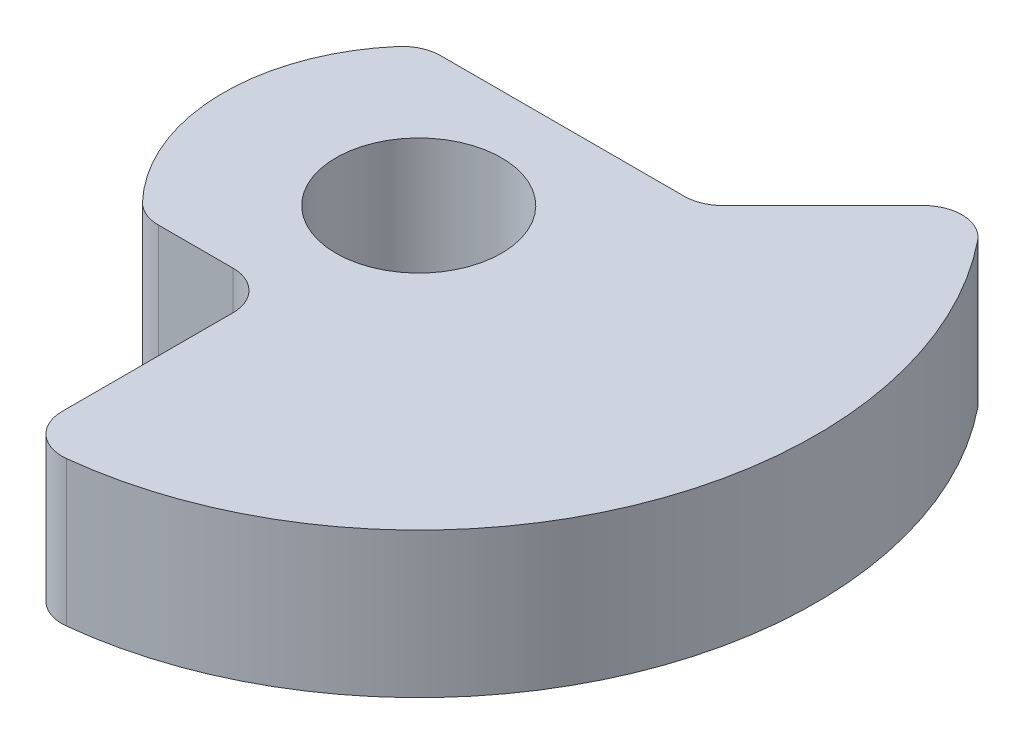
ISO-10303-21;
HEADER;
FILE_DESCRIPTION(('STEP AP214'),'2;1');
FILE_NAME('part.step','',(''),(''),'','','');
FILE_SCHEMA(('AUTOMOTIVE_DESIGN { 1 0 10303 214 1 1 1 1 }'));
ENDSEC;
DATA;
#1=APPLICATION_CONTEXT('core data for automotive mechanical design processes');
#2=APPLICATION_PROTOCOL_DEFINITION('international standard','automotive_design',2000,#1);
#3=PRODUCT_CONTEXT('',#1,'mechanical');
#4=PRODUCT('Part','Part','',(#3));
#5=PRODUCT_RELATED_PRODUCT_CATEGORY('part','',(#4));
#6=PRODUCT_DEFINITION_FORMATION('','',#4);
#7=PRODUCT_DEFINITION_CONTEXT('part definition',#1,'design');
#8=PRODUCT_DEFINITION('design','',#6,#7);
#9=PRODUCT_DEFINITION_SHAPE('','',#8);
#10=(LENGTH_UNIT() NAMED_UNIT(*) SI_UNIT(.MILLI.,.METRE.));
#11=(NAMED_UNIT(*) PLANE_ANGLE_UNIT() SI_UNIT($,.RADIAN.));
#12=(NAMED_UNIT(*) SI_UNIT($,.STERADIAN.) SOLID_ANGLE_UNIT());
#13=UNCERTAINTY_MEASURE_WITH_UNIT(LENGTH_MEASURE(1.E-05),#10,'distance_accuracy_value','');
#14=(GEOMETRIC_REPRESENTATION_CONTEXT(3) GLOBAL_UNCERTAINTY_ASSIGNED_CONTEXT((#13)) GLOBAL_UNIT_ASSIGNED_CONTEXT((#10,
#11,#12)) REPRESENTATION_CONTEXT('',''));
#15=CARTESIAN_POINT('',(0.,0.,0.));
#16=DIRECTION('',(0.,0.,1.));
#17=DIRECTION('',(1.,0.,0.));
#18=AXIS2_PLACEMENT_3D('',#15,#16,#17);
#19=CARTESIAN_POINT('',(13.13347224771,-9.525,16.8566076125247));
#20=DIRECTION('',(0.,0.,-1.));
#21=DIRECTION('',(-1.,0.,0.));
#22=AXIS2_PLACEMENT_3D('',#19,#20,#21);
#23=PLANE('',#22);
#24=DIRECTION('',(-1.,0.,0.));
#25=VECTOR('',#24,1.);
#26=CARTESIAN_POINT('',(13.13347224771,-9.525,16.8566076125247));
#27=LINE('',#26,#25);
#28=CARTESIAN_POINT('',(58.1370079297363,-9.525,16.8566076125247));
#29=VERTEX_POINT('',#28);
#30=CARTESIAN_POINT('',(42.1467495449524,-9.525,16.8566076125247));
#31=VERTEX_POINT('',#30);
#32=EDGE_CURVE('E143',#29,#31,#27,.T.);
#33=ORIENTED_EDGE('',*,*,#32,.T.);
#34=DIRECTION('',(0.,1.,0.));
#35=VECTOR('',#34,1.);
#36=CARTESIAN_POINT('',(42.1467495449524,-9.525,16.8566076125247));
#37=LINE('',#36,#35);
#38=CARTESIAN_POINT('',(42.1467495449524,0.,16.8566076125247));
#39=VERTEX_POINT('',#38);
#40=EDGE_CURVE('E185',#31,#39,#37,.T.);
#41=ORIENTED_EDGE('',*,*,#40,.T.);
#42=DIRECTION('',(-1.,0.,0.));
#43=VECTOR('',#42,1.);
#44=CARTESIAN_POINT('',(13.13347224771,0.,16.8566076125247));
#45=LINE('',#44,#43);
#46=CARTESIAN_POINT('',(58.1370079297363,0.,16.8566076125247));
#47=VERTEX_POINT('',#46);
#48=EDGE_CURVE('E148',#47,#39,#45,.T.);
#49=ORIENTED_EDGE('',*,*,#48,.F.);
#50=DIRECTION('',(0.,1.,0.));
#51=VECTOR('',#50,1.);
#52=CARTESIAN_POINT('',(58.1370079297363,-9.525,16.8566076125247));
#53=LINE('',#52,#51);
#54=EDGE_CURVE('E127',#47,#29,#53,.F.);
#55=ORIENTED_EDGE('',*,*,#54,.T.);
#56=EDGE_LOOP('',(#33,#41,#49,#55));
#57=FACE_BOUND('',#56,.T.);
#58=ADVANCED_FACE('F33',(#57),#23,.T.);
#59=CARTESIAN_POINT('',(29.6953439596014,-9.525,46.3503740310874));
#60=DIRECTION('',(0.707106781186549,0.,0.707106781186546));
#61=DIRECTION('',(0.707106781186546,0.,-0.707106781186549));
#62=AXIS2_PLACEMENT_3D('',#59,#60,#61);
#63=PLANE('',#62);
#64=DIRECTION('',(0.707106781186546,0.,-0.707106781186549));
#65=VECTOR('',#64,1.);
#66=CARTESIAN_POINT('',(29.6953439596014,0.,46.3503740310874));
#67=LINE('',#66,#65);
#68=CARTESIAN_POINT('',(59.9330591539502,0.,16.1126588367386));
#69=VERTEX_POINT('',#68);
#70=CARTESIAN_POINT('',(66.5087191751988,0.,9.53699881548994));
#71=VERTEX_POINT('',#70);
#72=EDGE_CURVE('E139',#69,#71,#67,.T.);
#73=ORIENTED_EDGE('',*,*,#72,.T.);
#74=DIRECTION('',(0.,-1.,0.));
#75=VECTOR('',#74,1.);
#76=CARTESIAN_POINT('',(66.5087191751988,-9.525,9.53699881548994));
#77=LINE('',#76,#75);
#78=CARTESIAN_POINT('',(66.5087191751988,-9.525,9.53699881548994));
#79=VERTEX_POINT('',#78);
#80=EDGE_CURVE('E176',#71,#79,#77,.T.);
#81=ORIENTED_EDGE('',*,*,#80,.T.);
#82=DIRECTION('',(0.707106781186546,0.,-0.707106781186549));
#83=VECTOR('',#82,1.);
#84=CARTESIAN_POINT('',(29.6953439596014,-9.525,46.3503740310874));
#85=LINE('',#84,#83);
#86=CARTESIAN_POINT('',(59.9330591539502,-9.525,16.1126588367386));
#87=VERTEX_POINT('',#86);
#88=EDGE_CURVE('E142',#87,#79,#85,.T.);
#89=ORIENTED_EDGE('',*,*,#88,.F.);
#90=DIRECTION('',(0.,1.,0.));
#91=VECTOR('',#90,1.);
#92=CARTESIAN_POINT('',(59.9330591539502,-9.525,16.1126588367386));
#93=LINE('',#92,#91);
#94=EDGE_CURVE('E126',#87,#69,#93,.T.);
#95=ORIENTED_EDGE('',*,*,#94,.T.);
#96=EDGE_LOOP('',(#73,#81,#89,#95));
#97=FACE_BOUND('',#96,.T.);
#98=ADVANCED_FACE('F138',(#97),#63,.F.);
#99=CARTESIAN_POINT('',(49.9480497375382,-9.525,26.0976682531505));
#100=DIRECTION('',(0.,1.,0.));
#101=DIRECTION('',(0.,0.,1.));
#102=AXIS2_PLACEMENT_3D('',#99,#100,#101);
#103=CYLINDRICAL_SURFACE('',#102,26.0976557502424);
#104=CARTESIAN_POINT('',(49.9480497375382,-9.525,26.0976682531505));
#105=DIRECTION('',(0.,1.,0.));
#106=DIRECTION('',(0.,0.,1.));
#107=AXIS2_PLACEMENT_3D('',#104,#105,#106);
#108=CIRCLE('',#107,26.0976557502424);
#109=CARTESIAN_POINT('',(52.7619139992627,-9.525,52.043184312284));
#110=VERTEX_POINT('',#109);
#111=CARTESIAN_POINT('',(70.2840025851398,-9.525,9.74112040715665));
#112=VERTEX_POINT('',#111);
#113=EDGE_CURVE('E238',#110,#112,#108,.T.);
#114=ORIENTED_EDGE('',*,*,#113,.T.);
#115=DIRECTION('',(0.,1.,0.));
#116=VECTOR('',#115,1.);
#117=CARTESIAN_POINT('',(70.2840025851398,-9.525,9.74112040715665));
#118=LINE('',#117,#116);
#119=CARTESIAN_POINT('',(70.2840025851398,0.,9.74112040715665));
#120=VERTEX_POINT('',#119);
#121=EDGE_CURVE('E170',#112,#120,#118,.T.);
#122=ORIENTED_EDGE('',*,*,#121,.T.);
#123=CARTESIAN_POINT('',(49.9480497375382,0.,26.0976682531505));
#124=DIRECTION('',(0.,1.,0.));
#125=DIRECTION('',(0.,0.,1.));
#126=AXIS2_PLACEMENT_3D('',#123,#124,#125);
#127=CIRCLE('',#126,26.0976557502424);
#128=CARTESIAN_POINT('',(52.7619139992627,0.,52.043184312284));
#129=VERTEX_POINT('',#128);
#130=EDGE_CURVE('E149',#129,#120,#127,.T.);
#131=ORIENTED_EDGE('',*,*,#130,.F.);
#132=DIRECTION('',(0.,1.,0.));
#133=VECTOR('',#132,1.);
#134=CARTESIAN_POINT('',(52.7619139992627,-9.525,52.043184312284));
#135=LINE('',#134,#133);
#136=EDGE_CURVE('E168',#129,#110,#135,.F.);
#137=ORIENTED_EDGE('',*,*,#136,.T.);
#138=EDGE_LOOP('',(#114,#122,#131,#137));
#139=FACE_BOUND('',#138,.T.);
#140=ADVANCED_FACE('F250',(#139),#103,.T.);
#141=CARTESIAN_POINT('',(49.9480497375382,-9.525,29.788502319196));
#142=DIRECTION('',(-1.,0.,0.));
#143=DIRECTION('',(0.,0.,1.));
#144=AXIS2_PLACEMENT_3D('',#141,#142,#143);
#145=PLANE('',#144);
#146=DIRECTION('',(0.,0.,1.));
#147=VECTOR('',#146,1.);
#148=CARTESIAN_POINT('',(49.9480497375382,-9.525,29.788502319196));
#149=LINE('',#148,#147);
#150=CARTESIAN_POINT('',(49.9480497375382,-9.525,38.2909540123679));
#151=VERTEX_POINT('',#150);
#152=CARTESIAN_POINT('',(49.9480497375382,-9.525,49.5179915738677));
#153=VERTEX_POINT('',#152);
#154=EDGE_CURVE('E235',#151,#153,#149,.T.);
#155=ORIENTED_EDGE('',*,*,#154,.T.);
#156=DIRECTION('',(0.,1.,0.));
#157=VECTOR('',#156,1.);
#158=CARTESIAN_POINT('',(49.9480497375382,-9.525,49.5179915738677));
#159=LINE('',#158,#157);
#160=CARTESIAN_POINT('',(49.9480497375382,0.,49.5179915738677));
#161=VERTEX_POINT('',#160);
#162=EDGE_CURVE('E182',#153,#161,#159,.T.);
#163=ORIENTED_EDGE('',*,*,#162,.T.);
#164=DIRECTION('',(0.,0.,1.));
#165=VECTOR('',#164,1.);
#166=CARTESIAN_POINT('',(49.9480497375382,0.,29.788502319196));
#167=LINE('',#166,#165);
#168=CARTESIAN_POINT('',(49.9480497375382,0.,38.2909540123679));
#169=VERTEX_POINT('',#168);
#170=EDGE_CURVE('E153',#169,#161,#167,.T.);
#171=ORIENTED_EDGE('',*,*,#170,.F.);
#172=DIRECTION('',(0.,1.,0.));
#173=VECTOR('',#172,1.);
#174=CARTESIAN_POINT('',(49.9480497375382,-9.525,38.2909540123679));
#175=LINE('',#174,#173);
#176=EDGE_CURVE('E133',#169,#151,#175,.F.);
#177=ORIENTED_EDGE('',*,*,#176,.T.);
#178=EDGE_LOOP('',(#155,#163,#171,#177));
#179=FACE_BOUND('',#178,.T.);
#180=ADVANCED_FACE('F227',(#179),#145,.T.);
#181=CARTESIAN_POINT('',(13.13347224771,-9.525,35.7509540123679));
#182=DIRECTION('',(0.,0.,1.));
#183=DIRECTION('',(1.,0.,0.));
#184=AXIS2_PLACEMENT_3D('',#181,#182,#183);
#185=PLANE('',#184);
#186=DIRECTION('',(1.,0.,0.));
#187=VECTOR('',#186,1.);
#188=CARTESIAN_POINT('',(13.13347224771,0.,35.7509540123679));
#189=LINE('',#188,#187);
#190=CARTESIAN_POINT('',(42.5206905761741,0.,35.7509540123679));
#191=VERTEX_POINT('',#190);
#192=CARTESIAN_POINT('',(47.4080497375382,0.,35.7509540123679));
#193=VERTEX_POINT('',#192);
#194=EDGE_CURVE('E214',#191,#193,#189,.T.);
#195=ORIENTED_EDGE('',*,*,#194,.F.);
#196=DIRECTION('',(0.,1.,0.));
#197=VECTOR('',#196,1.);
#198=CARTESIAN_POINT('',(42.5206905761741,-9.525,35.7509540123679));
#199=LINE('',#198,#197);
#200=CARTESIAN_POINT('',(42.5206905761741,-9.525,35.7509540123679));
#201=VERTEX_POINT('',#200);
#202=EDGE_CURVE('E11',#191,#201,#199,.F.);
#203=ORIENTED_EDGE('',*,*,#202,.T.);
#204=DIRECTION('',(1.,0.,0.));
#205=VECTOR('',#204,1.);
#206=CARTESIAN_POINT('',(13.13347224771,-9.525,35.7509540123679));
#207=LINE('',#206,#205);
#208=CARTESIAN_POINT('',(47.4080497375382,-9.525,35.7509540123679));
#209=VERTEX_POINT('',#208);
#210=EDGE_CURVE('E234',#201,#209,#207,.T.);
#211=ORIENTED_EDGE('',*,*,#210,.T.);
#212=DIRECTION('',(0.,1.,0.));
#213=VECTOR('',#212,1.);
#214=CARTESIAN_POINT('',(47.4080497375382,0.,35.7509540123679));
#215=LINE('',#214,#213);
#216=EDGE_CURVE('E158',#209,#193,#215,.T.);
#217=ORIENTED_EDGE('',*,*,#216,.T.);
#218=EDGE_LOOP('',(#195,#203,#211,#217));
#219=FACE_BOUND('',#218,.T.);
#220=ADVANCED_FACE('F274',(#219),#185,.T.);
#221=CARTESIAN_POINT('',(49.9480497375382,-9.525,26.0976682531505));
#222=DIRECTION('',(0.,1.,0.));
#223=DIRECTION('',(0.,0.,1.));
#224=AXIS2_PLACEMENT_3D('',#221,#222,#223);
#225=CYLINDRICAL_SURFACE('',#224,5.43427613349865);
#226=CARTESIAN_POINT('',(49.9480497375382,-9.525,26.0976682531505));
#227=DIRECTION('',(0.,1.,0.));
#228=DIRECTION('',(0.,0.,1.));
#229=AXIS2_PLACEMENT_3D('',#226,#227,#228);
#230=CIRCLE('',#229,5.43427613349865);
#231=CARTESIAN_POINT('',(49.9480497375382,-9.525,31.5319443866492));
#232=VERTEX_POINT('',#231);
#233=EDGE_CURVE('E151',#232,#232,#230,.T.);
#234=CARTESIAN_POINT('',(49.9480497375382,0.,26.0976682531505));
#235=DIRECTION('',(0.,1.,0.));
#236=DIRECTION('',(0.,0.,1.));
#237=AXIS2_PLACEMENT_3D('',#234,#235,#236);
#238=CIRCLE('',#237,5.43427613349865);
#239=CARTESIAN_POINT('',(49.9480497375382,0.,31.5319443866492));
#240=VERTEX_POINT('',#239);
#241=EDGE_CURVE('E215',#240,#240,#238,.T.);
#242=CARTESIAN_POINT('',(49.9480497375382,-9.525,31.5319443866492));
#243=CARTESIAN_POINT('',(49.9480497375382,-9.42578125,31.5319443866492));
#244=CARTESIAN_POINT('',(49.9480497375382,-9.3265625,31.5319443866492));
#245=CARTESIAN_POINT('',(49.9480497375382,-9.128125,31.5319443866492));
#246=CARTESIAN_POINT('',(49.9480497375382,-9.02890625,31.5319443866492));
#247=CARTESIAN_POINT('',(49.9480497375382,-8.83046875,31.5319443866492));
#248=CARTESIAN_POINT('',(49.9480497375382,-8.73125,31.5319443866492));
#249=CARTESIAN_POINT('',(49.9480497375382,-8.5328125,31.5319443866492));
#250=CARTESIAN_POINT('',(49.9480497375382,-8.43359375,31.5319443866492));
#251=CARTESIAN_POINT('',(49.9480497375382,-8.23515625,31.5319443866492));
#252=CARTESIAN_POINT('',(49.9480497375382,-8.1359375,31.5319443866492));
#253=CARTESIAN_POINT('',(49.9480497375382,-7.9375,31.5319443866492));
#254=CARTESIAN_POINT('',(49.9480497375382,-7.83828125,31.5319443866492));
#255=CARTESIAN_POINT('',(49.9480497375382,-7.63984375,31.5319443866492));
#256=CARTESIAN_POINT('',(49.9480497375382,-7.540625,31.5319443866492));
#257=CARTESIAN_POINT('',(49.9480497375382,-7.3421875,31.5319443866492));
#258=CARTESIAN_POINT('',(49.9480497375382,-7.24296875,31.5319443866492));
#259=CARTESIAN_POINT('',(49.9480497375382,-7.04453125,31.5319443866492));
#260=CARTESIAN_POINT('',(49.9480497375382,-6.9453125,31.5319443866492));
#261=CARTESIAN_POINT('',(49.9480497375382,-6.746875,31.5319443866492));
#262=CARTESIAN_POINT('',(49.9480497375382,-6.64765625,31.5319443866492));
#263=CARTESIAN_POINT('',(49.9480497375382,-6.44921875,31.5319443866492));
#264=CARTESIAN_POINT('',(49.9480497375382,-6.35,31.5319443866492));
#265=CARTESIAN_POINT('',(49.9480497375382,-6.1515625,31.5319443866492));
#266=CARTESIAN_POINT('',(49.9480497375382,-6.05234375,31.5319443866492));
#267=CARTESIAN_POINT('',(49.9480497375382,-5.85390625,31.5319443866492));
#268=CARTESIAN_POINT('',(49.9480497375382,-5.7546875,31.5319443866492));
#269=CARTESIAN_POINT('',(49.9480497375382,-5.55625,31.5319443866492));
#270=CARTESIAN_POINT('',(49.9480497375382,-5.45703125,31.5319443866492));
#271=CARTESIAN_POINT('',(49.9480497375382,-5.25859375,31.5319443866492));
#272=CARTESIAN_POINT('',(49.9480497375382,-5.159375,31.5319443866492));
#273=CARTESIAN_POINT('',(49.9480497375382,-4.9609375,31.5319443866492));
#274=CARTESIAN_POINT('',(49.9480497375382,-4.86171875,31.5319443866492));
#275=CARTESIAN_POINT('',(49.9480497375382,-4.66328125,31.5319443866492));
#276=CARTESIAN_POINT('',(49.9480497375382,-4.5640625,31.5319443866492));
#277=CARTESIAN_POINT('',(49.9480497375382,-4.365625,31.5319443866492));
#278=CARTESIAN_POINT('',(49.9480497375382,-4.26640625,31.5319443866492));
#279=CARTESIAN_POINT('',(49.9480497375382,-4.06796875,31.5319443866492));
#280=CARTESIAN_POINT('',(49.9480497375382,-3.96875,31.5319443866492));
#281=CARTESIAN_POINT('',(49.9480497375382,-3.7703125,31.5319443866492));
#282=CARTESIAN_POINT('',(49.9480497375382,-3.67109375,31.5319443866492));
#283=CARTESIAN_POINT('',(49.9480497375382,-3.47265625,31.5319443866492));
#284=CARTESIAN_POINT('',(49.9480497375382,-3.3734375,31.5319443866492));
#285=CARTESIAN_POINT('',(49.9480497375382,-3.175,31.5319443866492));
#286=CARTESIAN_POINT('',(49.9480497375382,-3.07578125,31.5319443866492));
#287=CARTESIAN_POINT('',(49.9480497375382,-2.87734375,31.5319443866492));
#288=CARTESIAN_POINT('',(49.9480497375382,-2.778125,31.5319443866492));
#289=CARTESIAN_POINT('',(49.9480497375382,-2.5796875,31.5319443866492));
#290=CARTESIAN_POINT('',(49.9480497375382,-2.48046875,31.5319443866492));
#291=CARTESIAN_POINT('',(49.9480497375382,-2.28203125,31.5319443866492));
#292=CARTESIAN_POINT('',(49.9480497375382,-2.1828125,31.5319443866492));
#293=CARTESIAN_POINT('',(49.9480497375382,-1.984375,31.5319443866492));
#294=CARTESIAN_POINT('',(49.9480497375382,-1.88515625,31.5319443866492));
#295=CARTESIAN_POINT('',(49.9480497375382,-1.68671875,31.5319443866492));
#296=CARTESIAN_POINT('',(49.9480497375382,-1.5875,31.5319443866492));
#297=CARTESIAN_POINT('',(49.9480497375382,-1.3890625,31.5319443866492));
#298=CARTESIAN_POINT('',(49.9480497375382,-1.28984375,31.5319443866492));
#299=CARTESIAN_POINT('',(49.9480497375382,-1.09140625,31.5319443866492));
#300=CARTESIAN_POINT('',(49.9480497375382,-0.992187500000001,31.5319443866492));
#301=CARTESIAN_POINT('',(49.9480497375382,-0.793750000000001,31.5319443866492));
#302=CARTESIAN_POINT('',(49.9480497375382,-0.69453125,31.5319443866492));
#303=CARTESIAN_POINT('',(49.9480497375382,-0.49609375,31.5319443866492));
#304=CARTESIAN_POINT('',(49.9480497375382,-0.396875,31.5319443866492));
#305=CARTESIAN_POINT('',(49.9480497375382,-0.1984375,31.5319443866492));
#306=CARTESIAN_POINT('',(49.9480497375382,-0.0992187500000001,31.5319443866492));
#307=CARTESIAN_POINT('',(49.9480497375382,0.,31.5319443866492));
#308=B_SPLINE_CURVE_WITH_KNOTS('',3,(#242,#243,#244,#245,#246,#247,#248,#249,#250,#251,#252,
#253,#254,#255,#256,#257,#258,#259,#260,#261,#262,#263,#264,#265,#266,#267,#268,#269,#270,#271,
#272,#273,#274,#275,#276,#277,#278,#279,#280,#281,#282,#283,#284,#285,#286,#287,#288,#289,#290,
#291,#292,#293,#294,#295,#296,#297,#298,#299,#300,#301,#302,#303,#304,#305,#306,#307),
.UNSPECIFIED.,.F.,.F.,(4,2,2,2,2,2,2,2,2,2,2,2,2,2,2,2,2,2,2,2,2,2,2,2,2,2,2,2,2,2,2,2,4),(0.,
0.29765625,0.5953125,0.892968750000001,1.190625,1.48828125,1.7859375,2.08359375,2.38125,
2.67890625,2.9765625,3.27421875,3.571875,3.86953125,4.1671875,4.46484375,4.7625,5.06015625,
5.3578125,5.65546875,5.953125,6.25078125,6.5484375,6.84609375,7.14375,7.44140625,7.7390625,
8.03671875,8.334375,8.63203125,8.9296875,9.22734375,9.525),.UNSPECIFIED.);
#309=EDGE_CURVE('BSEAM277',#232,#240,#308,.T.);
#310=ORIENTED_EDGE('',*,*,#233,.F.);
#311=ORIENTED_EDGE('',*,*,#241,.T.);
#312=ORIENTED_EDGE('',*,*,#309,.T.);
#313=ORIENTED_EDGE('',*,*,#309,.F.);
#314=EDGE_LOOP('',(#310,#312,#311,#313));
#315=FACE_BOUND('',#314,.T.);
#316=ADVANCED_FACE('F277',(#315),#225,.F.);
#317=CARTESIAN_POINT('',(49.9480497375382,-9.525,26.0976682531505));
#318=DIRECTION('',(0.,1.,0.));
#319=DIRECTION('',(0.,0.,1.));
#320=AXIS2_PLACEMENT_3D('',#317,#318,#319);
#321=CYLINDRICAL_SURFACE('',#320,12.8241868129758);
#322=CARTESIAN_POINT('',(49.9480497375382,0.,26.0976682531505));
#323=DIRECTION('',(0.,1.,0.));
#324=DIRECTION('',(0.,0.,1.));
#325=AXIS2_PLACEMENT_3D('',#322,#323,#324);
#326=CIRCLE('',#325,12.8241868129758);
#327=CARTESIAN_POINT('',(40.2199756687557,0.,17.7415721355618));
#328=VERTEX_POINT('',#327);
#329=CARTESIAN_POINT('',(40.6862730755058,0.,34.9678013117204));
#330=VERTEX_POINT('',#329);
#331=EDGE_CURVE('E210',#328,#330,#326,.T.);
#332=ORIENTED_EDGE('',*,*,#331,.F.);
#333=DIRECTION('',(0.,1.,0.));
#334=VECTOR('',#333,1.);
#335=CARTESIAN_POINT('',(40.2199756687557,-9.525,17.7415721355618));
#336=LINE('',#335,#334);
#337=CARTESIAN_POINT('',(40.2199756687557,-9.525,17.7415721355618));
#338=VERTEX_POINT('',#337);
#339=EDGE_CURVE('E195',#328,#338,#336,.F.);
#340=ORIENTED_EDGE('',*,*,#339,.T.);
#341=CARTESIAN_POINT('',(49.9480497375382,-9.525,26.0976682531505));
#342=DIRECTION('',(0.,1.,0.));
#343=DIRECTION('',(0.,0.,1.));
#344=AXIS2_PLACEMENT_3D('',#341,#342,#343);
#345=CIRCLE('',#344,12.8241868129758);
#346=CARTESIAN_POINT('',(40.6862730755058,-9.525,34.9678013117204));
#347=VERTEX_POINT('',#346);
#348=EDGE_CURVE('E201',#338,#347,#345,.T.);
#349=ORIENTED_EDGE('',*,*,#348,.T.);
#350=DIRECTION('',(0.,1.,0.));
#351=VECTOR('',#350,1.);
#352=CARTESIAN_POINT('',(40.6862730755058,-9.525,34.9678013117204));
#353=LINE('',#352,#351);
#354=EDGE_CURVE('E192',#347,#330,#353,.T.);
#355=ORIENTED_EDGE('',*,*,#354,.T.);
#356=EDGE_LOOP('',(#332,#340,#349,#355));
#357=FACE_BOUND('',#356,.T.);
#358=ADVANCED_FACE('F212',(#357),#321,.T.);
#359=CARTESIAN_POINT('',(13.13347224771,-9.525,29.788502319196));
#360=DIRECTION('',(0.,1.,0.));
#361=DIRECTION('',(0.,0.,1.));
#362=AXIS2_PLACEMENT_3D('',#359,#360,#361);
#363=PLANE('',#362);
#364=ORIENTED_EDGE('',*,*,#233,.T.);
#365=EDGE_LOOP('',(#364));
#366=FACE_BOUND('',#365,.T.);
#367=ORIENTED_EDGE('',*,*,#348,.F.);
#368=CARTESIAN_POINT('',(42.1467495449524,-9.525,19.3966076125247));
#369=DIRECTION('',(0.,1.,0.));
#370=DIRECTION('',(0.,0.,1.));
#371=AXIS2_PLACEMENT_3D('',#368,#369,#370);
#372=CIRCLE('',#371,2.54);
#373=EDGE_CURVE('E41',#338,#31,#372,.F.);
#374=ORIENTED_EDGE('',*,*,#373,.T.);
#375=ORIENTED_EDGE('',*,*,#32,.F.);
#376=CARTESIAN_POINT('',(58.1370079297364,-9.525,14.3166076125247));
#377=DIRECTION('',(0.,1.,0.));
#378=DIRECTION('',(0.,0.,1.));
#379=AXIS2_PLACEMENT_3D('',#376,#377,#378);
#380=CIRCLE('',#379,2.54);
#381=EDGE_CURVE('E132',#29,#87,#380,.T.);
#382=ORIENTED_EDGE('',*,*,#381,.T.);
#383=ORIENTED_EDGE('',*,*,#88,.T.);
#384=CARTESIAN_POINT('',(68.3047703994126,-9.525,11.3330500397038));
#385=DIRECTION('',(0.,1.,0.));
#386=DIRECTION('',(0.,0.,1.));
#387=AXIS2_PLACEMENT_3D('',#384,#385,#386);
#388=CIRCLE('',#387,2.54);
#389=EDGE_CURVE('E180',#79,#112,#388,.F.);
#390=ORIENTED_EDGE('',*,*,#389,.T.);
#391=ORIENTED_EDGE('',*,*,#113,.F.);
#392=CARTESIAN_POINT('',(52.4880497375382,-9.525,49.5179915738677));
#393=DIRECTION('',(0.,1.,0.));
#394=DIRECTION('',(0.,0.,1.));
#395=AXIS2_PLACEMENT_3D('',#392,#393,#394);
#396=CIRCLE('',#395,2.54);
#397=EDGE_CURVE('E178',#110,#153,#396,.F.);
#398=ORIENTED_EDGE('',*,*,#397,.T.);
#399=ORIENTED_EDGE('',*,*,#154,.F.);
#400=CARTESIAN_POINT('',(47.4080497375382,-9.525,38.2909540123679));
#401=DIRECTION('',(0.,1.,0.));
#402=DIRECTION('',(0.,0.,1.));
#403=AXIS2_PLACEMENT_3D('',#400,#401,#402);
#404=CIRCLE('',#403,2.54);
#405=EDGE_CURVE('E165',#151,#209,#404,.T.);
#406=ORIENTED_EDGE('',*,*,#405,.T.);
#407=ORIENTED_EDGE('',*,*,#210,.F.);
#408=CARTESIAN_POINT('',(42.5206905761741,-9.525,33.2109540123679));
#409=DIRECTION('',(0.,1.,0.));
#410=DIRECTION('',(0.,0.,1.));
#411=AXIS2_PLACEMENT_3D('',#408,#409,#410);
#412=CIRCLE('',#411,2.54);
#413=EDGE_CURVE('E53',#201,#347,#412,.F.);
#414=ORIENTED_EDGE('',*,*,#413,.T.);
#415=EDGE_LOOP('',(#367,#374,#375,#382,#383,#390,#391,#398,#399,#406,#407,#414));
#416=FACE_BOUND('',#415,.T.);
#417=ADVANCED_FACE('F200',(#366,#416),#363,.F.);
#418=CARTESIAN_POINT('',(13.13347224771,0.,29.788502319196));
#419=DIRECTION('',(0.,1.,0.));
#420=DIRECTION('',(0.,0.,1.));
#421=AXIS2_PLACEMENT_3D('',#418,#419,#420);
#422=PLANE('',#421);
#423=ORIENTED_EDGE('',*,*,#241,.F.);
#424=EDGE_LOOP('',(#423));
#425=FACE_BOUND('',#424,.T.);
#426=ORIENTED_EDGE('',*,*,#48,.T.);
#427=CARTESIAN_POINT('',(42.1467495449524,0.,19.3966076125247));
#428=DIRECTION('',(0.,1.,0.));
#429=DIRECTION('',(0.,0.,1.));
#430=AXIS2_PLACEMENT_3D('',#427,#428,#429);
#431=CIRCLE('',#430,2.54);
#432=EDGE_CURVE('E190',#39,#328,#431,.T.);
#433=ORIENTED_EDGE('',*,*,#432,.T.);
#434=ORIENTED_EDGE('',*,*,#331,.T.);
#435=CARTESIAN_POINT('',(42.5206905761741,0.,33.2109540123679));
#436=DIRECTION('',(0.,1.,0.));
#437=DIRECTION('',(0.,0.,1.));
#438=AXIS2_PLACEMENT_3D('',#435,#436,#437);
#439=CIRCLE('',#438,2.54);
#440=EDGE_CURVE('E188',#330,#191,#439,.T.);
#441=ORIENTED_EDGE('',*,*,#440,.T.);
#442=ORIENTED_EDGE('',*,*,#194,.T.);
#443=CARTESIAN_POINT('',(47.4080497375382,0.,38.2909540123679));
#444=DIRECTION('',(0.,1.,0.));
#445=DIRECTION('',(0.,0.,1.));
#446=AXIS2_PLACEMENT_3D('',#443,#444,#445);
#447=CIRCLE('',#446,2.54);
#448=EDGE_CURVE('E163',#193,#169,#447,.F.);
#449=ORIENTED_EDGE('',*,*,#448,.T.);
#450=ORIENTED_EDGE('',*,*,#170,.T.);
#451=CARTESIAN_POINT('',(52.4880497375382,0.,49.5179915738677));
#452=DIRECTION('',(0.,1.,0.));
#453=DIRECTION('',(0.,0.,1.));
#454=AXIS2_PLACEMENT_3D('',#451,#452,#453);
#455=CIRCLE('',#454,2.54);
#456=EDGE_CURVE('E173',#161,#129,#455,.T.);
#457=ORIENTED_EDGE('',*,*,#456,.T.);
#458=ORIENTED_EDGE('',*,*,#130,.T.);
#459=CARTESIAN_POINT('',(68.3047703994126,0.,11.3330500397038));
#460=DIRECTION('',(0.,1.,0.));
#461=DIRECTION('',(0.,0.,1.));
#462=AXIS2_PLACEMENT_3D('',#459,#460,#461);
#463=CIRCLE('',#462,2.54);
#464=EDGE_CURVE('E147',#120,#71,#463,.T.);
#465=ORIENTED_EDGE('',*,*,#464,.T.);
#466=ORIENTED_EDGE('',*,*,#72,.F.);
#467=CARTESIAN_POINT('',(58.1370079297364,0.,14.3166076125247));
#468=DIRECTION('',(0.,1.,0.));
#469=DIRECTION('',(0.,0.,1.));
#470=AXIS2_PLACEMENT_3D('',#467,#468,#469);
#471=CIRCLE('',#470,2.54);
#472=EDGE_CURVE('E122',#69,#47,#471,.F.);
#473=ORIENTED_EDGE('',*,*,#472,.T.);
#474=EDGE_LOOP('',(#426,#433,#434,#441,#442,#449,#450,#457,#458,#465,#466,#473));
#475=FACE_BOUND('',#474,.T.);
#476=ADVANCED_FACE('F145',(#425,#475),#422,.T.);
#477=CARTESIAN_POINT('',(58.1370079297364,-9.525,14.3166076125247));
#478=DIRECTION('',(0.,1.,0.));
#479=DIRECTION('',(0.,0.,1.));
#480=AXIS2_PLACEMENT_3D('',#477,#478,#479);
#481=CYLINDRICAL_SURFACE('',#480,2.54);
#482=ORIENTED_EDGE('',*,*,#381,.F.);
#483=ORIENTED_EDGE('',*,*,#54,.F.);
#484=ORIENTED_EDGE('',*,*,#472,.F.);
#485=ORIENTED_EDGE('',*,*,#94,.F.);
#486=EDGE_LOOP('',(#482,#483,#484,#485));
#487=FACE_BOUND('',#486,.T.);
#488=ADVANCED_FACE('F125',(#487),#481,.F.);
#489=CARTESIAN_POINT('',(47.4080497375382,-9.525,38.2909540123679));
#490=DIRECTION('',(0.,-1.,0.));
#491=DIRECTION('',(0.,0.,-1.));
#492=AXIS2_PLACEMENT_3D('',#489,#490,#491);
#493=CYLINDRICAL_SURFACE('',#492,2.54);
#494=ORIENTED_EDGE('',*,*,#405,.F.);
#495=ORIENTED_EDGE('',*,*,#176,.F.);
#496=ORIENTED_EDGE('',*,*,#448,.F.);
#497=ORIENTED_EDGE('',*,*,#216,.F.);
#498=EDGE_LOOP('',(#494,#495,#496,#497));
#499=FACE_BOUND('',#498,.T.);
#500=ADVANCED_FACE('F232',(#499),#493,.F.);
#501=CARTESIAN_POINT('',(68.3047703994126,-9.525,11.3330500397038));
#502=DIRECTION('',(0.,1.,0.));
#503=DIRECTION('',(0.,0.,1.));
#504=AXIS2_PLACEMENT_3D('',#501,#502,#503);
#505=CYLINDRICAL_SURFACE('',#504,2.54);
#506=ORIENTED_EDGE('',*,*,#389,.F.);
#507=ORIENTED_EDGE('',*,*,#80,.F.);
#508=ORIENTED_EDGE('',*,*,#464,.F.);
#509=ORIENTED_EDGE('',*,*,#121,.F.);
#510=EDGE_LOOP('',(#506,#507,#508,#509));
#511=FACE_BOUND('',#510,.T.);
#512=ADVANCED_FACE('F248',(#511),#505,.T.);
#513=CARTESIAN_POINT('',(52.4880497375382,-9.525,49.5179915738677));
#514=DIRECTION('',(0.,1.,0.));
#515=DIRECTION('',(0.,0.,1.));
#516=AXIS2_PLACEMENT_3D('',#513,#514,#515);
#517=CYLINDRICAL_SURFACE('',#516,2.54);
#518=ORIENTED_EDGE('',*,*,#397,.F.);
#519=ORIENTED_EDGE('',*,*,#136,.F.);
#520=ORIENTED_EDGE('',*,*,#456,.F.);
#521=ORIENTED_EDGE('',*,*,#162,.F.);
#522=EDGE_LOOP('',(#518,#519,#520,#521));
#523=FACE_BOUND('',#522,.T.);
#524=ADVANCED_FACE('F253',(#523),#517,.T.);
#525=CARTESIAN_POINT('',(42.1467495449524,-9.525,19.3966076125247));
#526=DIRECTION('',(0.,1.,0.));
#527=DIRECTION('',(0.,0.,1.));
#528=AXIS2_PLACEMENT_3D('',#525,#526,#527);
#529=CYLINDRICAL_SURFACE('',#528,2.54);
#530=ORIENTED_EDGE('',*,*,#373,.F.);
#531=ORIENTED_EDGE('',*,*,#339,.F.);
#532=ORIENTED_EDGE('',*,*,#432,.F.);
#533=ORIENTED_EDGE('',*,*,#40,.F.);
#534=EDGE_LOOP('',(#530,#531,#532,#533));
#535=FACE_BOUND('',#534,.T.);
#536=ADVANCED_FACE('F207',(#535),#529,.T.);
#537=CARTESIAN_POINT('',(42.5206905761741,-9.525,33.2109540123679));
#538=DIRECTION('',(0.,1.,0.));
#539=DIRECTION('',(0.,0.,1.));
#540=AXIS2_PLACEMENT_3D('',#537,#538,#539);
#541=CYLINDRICAL_SURFACE('',#540,2.54);
#542=ORIENTED_EDGE('',*,*,#413,.F.);
#543=ORIENTED_EDGE('',*,*,#202,.F.);
#544=ORIENTED_EDGE('',*,*,#440,.F.);
#545=ORIENTED_EDGE('',*,*,#354,.F.);
#546=EDGE_LOOP('',(#542,#543,#544,#545));
#547=FACE_BOUND('',#546,.T.);
#548=ADVANCED_FACE('F35',(#547),#541,.T.);
#549=CLOSED_SHELL('',(#58,#98,#140,#180,#220,#316,#358,#417,#476,#488,#500,#512,#524,#536,#548));
#550=MANIFOLD_SOLID_BREP('B2',#549);
#551=ADVANCED_BREP_SHAPE_REPRESENTATION('',(#18,#550),#14);
#552=SHAPE_DEFINITION_REPRESENTATION(#9,#551);
ENDSEC;
END-ISO-10303-21;
